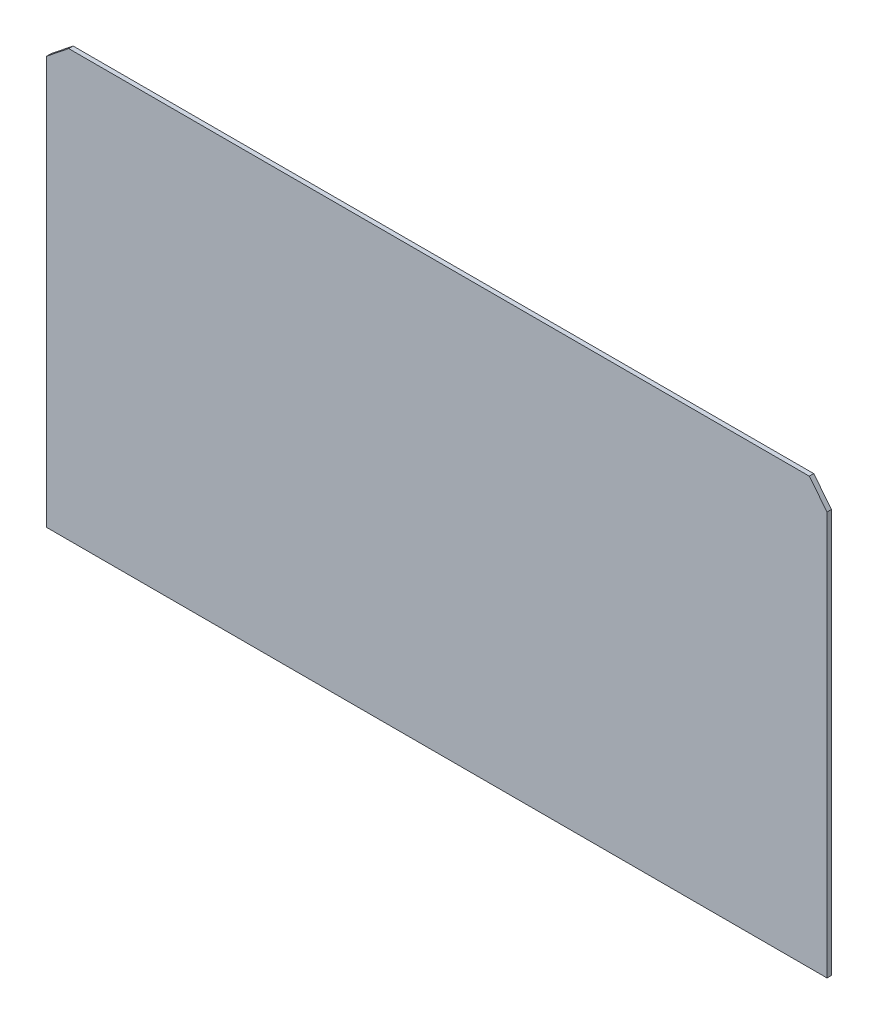
ISO-10303-21;
HEADER;
FILE_DESCRIPTION(('STEP AP214'),'2;1');
FILE_NAME('part.step','',(''),(''),'','','');
FILE_SCHEMA(('AUTOMOTIVE_DESIGN { 1 0 10303 214 1 1 1 1 }'));
ENDSEC;
DATA;
#1=APPLICATION_CONTEXT('core data for automotive mechanical design processes');
#2=APPLICATION_PROTOCOL_DEFINITION('international standard','automotive_design',2000,#1);
#3=PRODUCT_CONTEXT('',#1,'mechanical');
#4=PRODUCT('Part','Part','',(#3));
#5=PRODUCT_RELATED_PRODUCT_CATEGORY('part','',(#4));
#6=PRODUCT_DEFINITION_FORMATION('','',#4);
#7=PRODUCT_DEFINITION_CONTEXT('part definition',#1,'design');
#8=PRODUCT_DEFINITION('design','',#6,#7);
#9=PRODUCT_DEFINITION_SHAPE('','',#8);
#10=(LENGTH_UNIT() NAMED_UNIT(*) SI_UNIT(.MILLI.,.METRE.));
#11=(NAMED_UNIT(*) PLANE_ANGLE_UNIT() SI_UNIT($,.RADIAN.));
#12=(NAMED_UNIT(*) SI_UNIT($,.STERADIAN.) SOLID_ANGLE_UNIT());
#13=UNCERTAINTY_MEASURE_WITH_UNIT(LENGTH_MEASURE(1.E-05),#10,'distance_accuracy_value','');
#14=(GEOMETRIC_REPRESENTATION_CONTEXT(3) GLOBAL_UNCERTAINTY_ASSIGNED_CONTEXT((#13)) GLOBAL_UNIT_ASSIGNED_CONTEXT((#10,
#11,#12)) REPRESENTATION_CONTEXT('',''));
#15=CARTESIAN_POINT('',(0.,0.,0.));
#16=DIRECTION('',(0.,0.,1.));
#17=DIRECTION('',(1.,0.,0.));
#18=AXIS2_PLACEMENT_3D('',#15,#16,#17);
#19=CARTESIAN_POINT('',(0.,0.,3.175));
#20=DIRECTION('',(1.,0.,0.));
#21=DIRECTION('',(0.,0.,-1.));
#22=AXIS2_PLACEMENT_3D('',#19,#20,#21);
#23=PLANE('',#22);
#24=DIRECTION('',(0.,-1.,0.));
#25=VECTOR('',#24,1.);
#26=CARTESIAN_POINT('',(0.,0.,3.175));
#27=LINE('',#26,#25);
#28=CARTESIAN_POINT('',(0.,292.1,3.175));
#29=VERTEX_POINT('',#28);
#30=CARTESIAN_POINT('',(0.,0.,3.175));
#31=VERTEX_POINT('',#30);
#32=EDGE_CURVE('E87',#29,#31,#27,.T.);
#33=ORIENTED_EDGE('',*,*,#32,.F.);
#34=DIRECTION('',(0.,0.,-1.));
#35=VECTOR('',#34,1.);
#36=CARTESIAN_POINT('',(0.,292.1,3.175));
#37=LINE('',#36,#35);
#38=CARTESIAN_POINT('',(0.,292.1,0.));
#39=VERTEX_POINT('',#38);
#40=EDGE_CURVE('E110',#29,#39,#37,.T.);
#41=ORIENTED_EDGE('',*,*,#40,.T.);
#42=DIRECTION('',(0.,-1.,0.));
#43=VECTOR('',#42,1.);
#44=CARTESIAN_POINT('',(0.,0.,0.));
#45=LINE('',#44,#43);
#46=CARTESIAN_POINT('',(0.,0.,0.));
#47=VERTEX_POINT('',#46);
#48=EDGE_CURVE('E108',#39,#47,#45,.T.);
#49=ORIENTED_EDGE('',*,*,#48,.T.);
#50=DIRECTION('',(0.,0.,-1.));
#51=VECTOR('',#50,1.);
#52=CARTESIAN_POINT('',(0.,0.,3.175));
#53=LINE('',#52,#51);
#54=EDGE_CURVE('E102',#31,#47,#53,.T.);
#55=ORIENTED_EDGE('',*,*,#54,.F.);
#56=EDGE_LOOP('',(#33,#41,#49,#55));
#57=FACE_BOUND('',#56,.T.);
#58=ADVANCED_FACE('F33',(#57),#23,.F.);
#59=CARTESIAN_POINT('',(0.,0.,3.175));
#60=DIRECTION('',(0.,1.,0.));
#61=DIRECTION('',(0.,0.,1.));
#62=AXIS2_PLACEMENT_3D('',#59,#60,#61);
#63=PLANE('',#62);
#64=DIRECTION('',(1.,0.,0.));
#65=VECTOR('',#64,1.);
#66=CARTESIAN_POINT('',(0.,0.,0.));
#67=LINE('',#66,#65);
#68=CARTESIAN_POINT('',(558.8,0.,0.));
#69=VERTEX_POINT('',#68);
#70=EDGE_CURVE('E137',#47,#69,#67,.T.);
#71=ORIENTED_EDGE('',*,*,#70,.T.);
#72=DIRECTION('',(0.,0.,-1.));
#73=VECTOR('',#72,1.);
#74=CARTESIAN_POINT('',(558.8,0.,3.175));
#75=LINE('',#74,#73);
#76=CARTESIAN_POINT('',(558.8,0.,3.175));
#77=VERTEX_POINT('',#76);
#78=EDGE_CURVE('E104',#77,#69,#75,.T.);
#79=ORIENTED_EDGE('',*,*,#78,.F.);
#80=DIRECTION('',(1.,0.,0.));
#81=VECTOR('',#80,1.);
#82=CARTESIAN_POINT('',(0.,0.,3.175));
#83=LINE('',#82,#81);
#84=EDGE_CURVE('E90',#31,#77,#83,.T.);
#85=ORIENTED_EDGE('',*,*,#84,.F.);
#86=ORIENTED_EDGE('',*,*,#54,.T.);
#87=EDGE_LOOP('',(#71,#79,#85,#86));
#88=FACE_BOUND('',#87,.T.);
#89=ADVANCED_FACE('F101',(#88),#63,.F.);
#90=CARTESIAN_POINT('',(558.8,0.,3.175));
#91=DIRECTION('',(-1.,0.,0.));
#92=DIRECTION('',(0.,0.,1.));
#93=AXIS2_PLACEMENT_3D('',#90,#91,#92);
#94=PLANE('',#93);
#95=DIRECTION('',(0.,1.,0.));
#96=VECTOR('',#95,1.);
#97=CARTESIAN_POINT('',(558.8,0.,0.));
#98=LINE('',#97,#96);
#99=CARTESIAN_POINT('',(558.8,288.925,0.));
#100=VERTEX_POINT('',#99);
#101=EDGE_CURVE('E135',#69,#100,#98,.T.);
#102=ORIENTED_EDGE('',*,*,#101,.T.);
#103=DIRECTION('',(0.,0.,1.));
#104=VECTOR('',#103,1.);
#105=CARTESIAN_POINT('',(558.8,288.925,3.175));
#106=LINE('',#105,#104);
#107=CARTESIAN_POINT('',(558.8,288.925,3.175));
#108=VERTEX_POINT('',#107);
#109=EDGE_CURVE('E11',#100,#108,#106,.T.);
#110=ORIENTED_EDGE('',*,*,#109,.T.);
#111=DIRECTION('',(0.,1.,0.));
#112=VECTOR('',#111,1.);
#113=CARTESIAN_POINT('',(558.8,0.,3.175));
#114=LINE('',#113,#112);
#115=EDGE_CURVE('E105',#77,#108,#114,.T.);
#116=ORIENTED_EDGE('',*,*,#115,.F.);
#117=ORIENTED_EDGE('',*,*,#78,.T.);
#118=EDGE_LOOP('',(#102,#110,#116,#117));
#119=FACE_BOUND('',#118,.T.);
#120=ADVANCED_FACE('F136',(#119),#94,.F.);
#121=CARTESIAN_POINT('',(0.,304.8,3.175));
#122=DIRECTION('',(0.,-1.,0.));
#123=DIRECTION('',(0.,0.,-1.));
#124=AXIS2_PLACEMENT_3D('',#121,#122,#123);
#125=PLANE('',#124);
#126=DIRECTION('',(-1.,0.,0.));
#127=VECTOR('',#126,1.);
#128=CARTESIAN_POINT('',(0.,304.8,0.));
#129=LINE('',#128,#127);
#130=CARTESIAN_POINT('',(546.1,304.8,0.));
#131=VERTEX_POINT('',#130);
#132=CARTESIAN_POINT('',(15.875,304.8,0.));
#133=VERTEX_POINT('',#132);
#134=EDGE_CURVE('E97',#131,#133,#129,.T.);
#135=ORIENTED_EDGE('',*,*,#134,.T.);
#136=DIRECTION('',(0.,0.,1.));
#137=VECTOR('',#136,1.);
#138=CARTESIAN_POINT('',(15.875,304.8,3.175));
#139=LINE('',#138,#137);
#140=CARTESIAN_POINT('',(15.875,304.8,3.175));
#141=VERTEX_POINT('',#140);
#142=EDGE_CURVE('E54',#133,#141,#139,.T.);
#143=ORIENTED_EDGE('',*,*,#142,.T.);
#144=DIRECTION('',(-1.,0.,0.));
#145=VECTOR('',#144,1.);
#146=CARTESIAN_POINT('',(0.,304.8,3.175));
#147=LINE('',#146,#145);
#148=CARTESIAN_POINT('',(546.1,304.8,3.175));
#149=VERTEX_POINT('',#148);
#150=EDGE_CURVE('E114',#149,#141,#147,.T.);
#151=ORIENTED_EDGE('',*,*,#150,.F.);
#152=DIRECTION('',(0.,0.,-1.));
#153=VECTOR('',#152,1.);
#154=CARTESIAN_POINT('',(546.1,304.8,3.175));
#155=LINE('',#154,#153);
#156=EDGE_CURVE('E121',#149,#131,#155,.T.);
#157=ORIENTED_EDGE('',*,*,#156,.T.);
#158=EDGE_LOOP('',(#135,#143,#151,#157));
#159=FACE_BOUND('',#158,.T.);
#160=ADVANCED_FACE('F129',(#159),#125,.F.);
#161=CARTESIAN_POINT('',(0.,0.,3.175));
#162=DIRECTION('',(0.,0.,-1.));
#163=DIRECTION('',(-1.,0.,0.));
#164=AXIS2_PLACEMENT_3D('',#161,#162,#163);
#165=PLANE('',#164);
#166=ORIENTED_EDGE('',*,*,#150,.T.);
#167=DIRECTION('',(0.78086880944303,0.624695047554425,0.));
#168=VECTOR('',#167,1.);
#169=CARTESIAN_POINT('',(0.,292.1,3.175));
#170=LINE('',#169,#168);
#171=EDGE_CURVE('E41',#141,#29,#170,.F.);
#172=ORIENTED_EDGE('',*,*,#171,.T.);
#173=ORIENTED_EDGE('',*,*,#32,.T.);
#174=ORIENTED_EDGE('',*,*,#84,.T.);
#175=ORIENTED_EDGE('',*,*,#115,.T.);
#176=DIRECTION('',(0.624695047554426,-0.780868809443029,0.));
#177=VECTOR('',#176,1.);
#178=CARTESIAN_POINT('',(546.1,304.8,3.175));
#179=LINE('',#178,#177);
#180=EDGE_CURVE('E125',#108,#149,#179,.F.);
#181=ORIENTED_EDGE('',*,*,#180,.T.);
#182=EDGE_LOOP('',(#166,#172,#173,#174,#175,#181));
#183=FACE_BOUND('',#182,.T.);
#184=ADVANCED_FACE('F89',(#183),#165,.F.);
#185=CARTESIAN_POINT('',(0.,0.,0.));
#186=DIRECTION('',(0.,0.,-1.));
#187=DIRECTION('',(-1.,0.,0.));
#188=AXIS2_PLACEMENT_3D('',#185,#186,#187);
#189=PLANE('',#188);
#190=ORIENTED_EDGE('',*,*,#48,.F.);
#191=DIRECTION('',(-0.78086880944303,-0.624695047554425,0.));
#192=VECTOR('',#191,1.);
#193=CARTESIAN_POINT('',(-142.487804878049,178.109756097561,0.));
#194=LINE('',#193,#192);
#195=EDGE_CURVE('E119',#39,#133,#194,.F.);
#196=ORIENTED_EDGE('',*,*,#195,.T.);
#197=ORIENTED_EDGE('',*,*,#134,.F.);
#198=DIRECTION('',(-0.624695047554426,0.780868809443029,0.));
#199=VECTOR('',#198,1.);
#200=CARTESIAN_POINT('',(481.670731707316,385.336585365855,0.));
#201=LINE('',#200,#199);
#202=EDGE_CURVE('E112',#131,#100,#201,.F.);
#203=ORIENTED_EDGE('',*,*,#202,.T.);
#204=ORIENTED_EDGE('',*,*,#101,.F.);
#205=ORIENTED_EDGE('',*,*,#70,.F.);
#206=EDGE_LOOP('',(#190,#196,#197,#203,#204,#205));
#207=FACE_BOUND('',#206,.T.);
#208=ADVANCED_FACE('F134',(#207),#189,.T.);
#209=CARTESIAN_POINT('',(0.,292.1,3.175));
#210=DIRECTION('',(0.624695047554425,-0.78086880944303,0.));
#211=DIRECTION('',(0.,0.,-1.));
#212=AXIS2_PLACEMENT_3D('',#209,#210,#211);
#213=PLANE('',#212);
#214=ORIENTED_EDGE('',*,*,#171,.F.);
#215=ORIENTED_EDGE('',*,*,#142,.F.);
#216=ORIENTED_EDGE('',*,*,#195,.F.);
#217=ORIENTED_EDGE('',*,*,#40,.F.);
#218=EDGE_LOOP('',(#214,#215,#216,#217));
#219=FACE_BOUND('',#218,.T.);
#220=ADVANCED_FACE('F143',(#219),#213,.F.);
#221=CARTESIAN_POINT('',(546.1,304.8,3.175));
#222=DIRECTION('',(-0.780868809443029,-0.624695047554426,0.));
#223=DIRECTION('',(0.,0.,-1.));
#224=AXIS2_PLACEMENT_3D('',#221,#222,#223);
#225=PLANE('',#224);
#226=ORIENTED_EDGE('',*,*,#180,.F.);
#227=ORIENTED_EDGE('',*,*,#109,.F.);
#228=ORIENTED_EDGE('',*,*,#202,.F.);
#229=ORIENTED_EDGE('',*,*,#156,.F.);
#230=EDGE_LOOP('',(#226,#227,#228,#229));
#231=FACE_BOUND('',#230,.T.);
#232=ADVANCED_FACE('F35',(#231),#225,.F.);
#233=CLOSED_SHELL('',(#58,#89,#120,#160,#184,#208,#220,#232));
#234=MANIFOLD_SOLID_BREP('B2',#233);
#235=ADVANCED_BREP_SHAPE_REPRESENTATION('',(#18,#234),#14);
#236=SHAPE_DEFINITION_REPRESENTATION(#9,#235);
ENDSEC;
END-ISO-10303-21;
